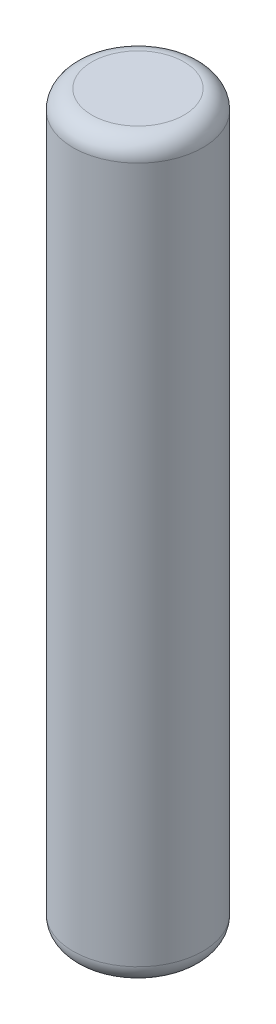
ISO-10303-21;
HEADER;
FILE_DESCRIPTION(('STEP AP214'),'2;1');
FILE_NAME('part.step','',(''),(''),'','','');
FILE_SCHEMA(('AUTOMOTIVE_DESIGN { 1 0 10303 214 1 1 1 1 }'));
ENDSEC;
DATA;
#1=APPLICATION_CONTEXT('core data for automotive mechanical design processes');
#2=APPLICATION_PROTOCOL_DEFINITION('international standard','automotive_design',2000,#1);
#3=PRODUCT_CONTEXT('',#1,'mechanical');
#4=PRODUCT('Part','Part','',(#3));
#5=PRODUCT_RELATED_PRODUCT_CATEGORY('part','',(#4));
#6=PRODUCT_DEFINITION_FORMATION('','',#4);
#7=PRODUCT_DEFINITION_CONTEXT('part definition',#1,'design');
#8=PRODUCT_DEFINITION('design','',#6,#7);
#9=PRODUCT_DEFINITION_SHAPE('','',#8);
#10=(LENGTH_UNIT() NAMED_UNIT(*) SI_UNIT(.MILLI.,.METRE.));
#11=(NAMED_UNIT(*) PLANE_ANGLE_UNIT() SI_UNIT($,.RADIAN.));
#12=(NAMED_UNIT(*) SI_UNIT($,.STERADIAN.) SOLID_ANGLE_UNIT());
#13=UNCERTAINTY_MEASURE_WITH_UNIT(LENGTH_MEASURE(1.E-05),#10,'distance_accuracy_value','');
#14=(GEOMETRIC_REPRESENTATION_CONTEXT(3) GLOBAL_UNCERTAINTY_ASSIGNED_CONTEXT((#13)) GLOBAL_UNIT_ASSIGNED_CONTEXT((#10,
#11,#12)) REPRESENTATION_CONTEXT('',''));
#15=CARTESIAN_POINT('',(0.,0.,0.));
#16=DIRECTION('',(0.,0.,1.));
#17=DIRECTION('',(1.,0.,0.));
#18=AXIS2_PLACEMENT_3D('',#15,#16,#17);
#19=CARTESIAN_POINT('',(0.,19.5,0.));
#20=DIRECTION('',(0.,-1.,0.));
#21=DIRECTION('',(0.,0.,-1.));
#22=AXIS2_PLACEMENT_3D('',#19,#20,#21);
#23=CYLINDRICAL_SURFACE('',#22,3.45);
#24=CARTESIAN_POINT('',(0.,-18.5,0.));
#25=DIRECTION('',(0.,1.,0.));
#26=DIRECTION('',(0.,0.,1.));
#27=AXIS2_PLACEMENT_3D('',#24,#25,#26);
#28=CIRCLE('',#27,3.45);
#29=CARTESIAN_POINT('',(0.,-18.5,3.45));
#30=VERTEX_POINT('',#29);
#31=EDGE_CURVE('E54',#30,#30,#28,.T.);
#32=ORIENTED_EDGE('',*,*,#31,.T.);
#33=EDGE_LOOP('',(#32));
#34=FACE_BOUND('',#33,.T.);
#35=CARTESIAN_POINT('',(0.,18.5,0.));
#36=DIRECTION('',(0.,1.,0.));
#37=DIRECTION('',(0.,0.,1.));
#38=AXIS2_PLACEMENT_3D('',#35,#36,#37);
#39=CIRCLE('',#38,3.45);
#40=CARTESIAN_POINT('',(0.,18.5,3.45));
#41=VERTEX_POINT('',#40);
#42=EDGE_CURVE('E58',#41,#41,#39,.F.);
#43=ORIENTED_EDGE('',*,*,#42,.T.);
#44=EDGE_LOOP('',(#43));
#45=FACE_BOUND('',#44,.T.);
#46=ADVANCED_FACE('F43',(#34,#45),#23,.T.);
#47=CARTESIAN_POINT('',(0.,19.5,0.));
#48=DIRECTION('',(0.,1.,0.));
#49=DIRECTION('',(0.,0.,1.));
#50=AXIS2_PLACEMENT_3D('',#47,#48,#49);
#51=PLANE('',#50);
#52=CARTESIAN_POINT('',(0.,19.5,0.));
#53=DIRECTION('',(0.,1.,0.));
#54=DIRECTION('',(0.,0.,1.));
#55=AXIS2_PLACEMENT_3D('',#52,#53,#54);
#56=CIRCLE('',#55,2.45);
#57=CARTESIAN_POINT('',(0.,19.5,2.45));
#58=VERTEX_POINT('',#57);
#59=EDGE_CURVE('E10',#58,#58,#56,.T.);
#60=ORIENTED_EDGE('',*,*,#59,.T.);
#61=EDGE_LOOP('',(#60));
#62=FACE_BOUND('',#61,.T.);
#63=ADVANCED_FACE('F74',(#62),#51,.T.);
#64=CARTESIAN_POINT('',(0.,-19.5,0.));
#65=DIRECTION('',(0.,1.,0.));
#66=DIRECTION('',(0.,0.,1.));
#67=AXIS2_PLACEMENT_3D('',#64,#65,#66);
#68=PLANE('',#67);
#69=CARTESIAN_POINT('',(0.,-19.5,0.));
#70=DIRECTION('',(0.,1.,0.));
#71=DIRECTION('',(0.,0.,1.));
#72=AXIS2_PLACEMENT_3D('',#69,#70,#71);
#73=CIRCLE('',#72,2.45);
#74=CARTESIAN_POINT('',(0.,-19.5,2.45));
#75=VERTEX_POINT('',#74);
#76=EDGE_CURVE('E50',#75,#75,#73,.F.);
#77=ORIENTED_EDGE('',*,*,#76,.T.);
#78=EDGE_LOOP('',(#77));
#79=FACE_BOUND('',#78,.T.);
#80=ADVANCED_FACE('F71',(#79),#68,.F.);
#81=CARTESIAN_POINT('',(0.,-18.5,0.));
#82=DIRECTION('',(0.,1.,0.));
#83=DIRECTION('',(0.,0.,1.));
#84=AXIS2_PLACEMENT_3D('',#81,#82,#83);
#85=TOROIDAL_SURFACE('',#84,2.45,1.);
#86=ORIENTED_EDGE('',*,*,#76,.F.);
#87=EDGE_LOOP('',(#86));
#88=FACE_BOUND('',#87,.T.);
#89=ORIENTED_EDGE('',*,*,#31,.F.);
#90=EDGE_LOOP('',(#89));
#91=FACE_BOUND('',#90,.T.);
#92=ADVANCED_FACE('F67',(#88,#91),#85,.T.);
#93=CARTESIAN_POINT('',(0.,18.5,0.));
#94=DIRECTION('',(0.,1.,0.));
#95=DIRECTION('',(0.,0.,1.));
#96=AXIS2_PLACEMENT_3D('',#93,#94,#95);
#97=TOROIDAL_SURFACE('',#96,2.45,1.);
#98=ORIENTED_EDGE('',*,*,#42,.F.);
#99=EDGE_LOOP('',(#98));
#100=FACE_BOUND('',#99,.T.);
#101=ORIENTED_EDGE('',*,*,#59,.F.);
#102=EDGE_LOOP('',(#101));
#103=FACE_BOUND('',#102,.T.);
#104=ADVANCED_FACE('F45',(#100,#103),#97,.T.);
#105=CLOSED_SHELL('',(#46,#63,#80,#92,#104));
#106=MANIFOLD_SOLID_BREP('B2',#105);
#107=ADVANCED_BREP_SHAPE_REPRESENTATION('',(#18,#106),#14);
#108=SHAPE_DEFINITION_REPRESENTATION(#9,#107);
ENDSEC;
END-ISO-10303-21;
